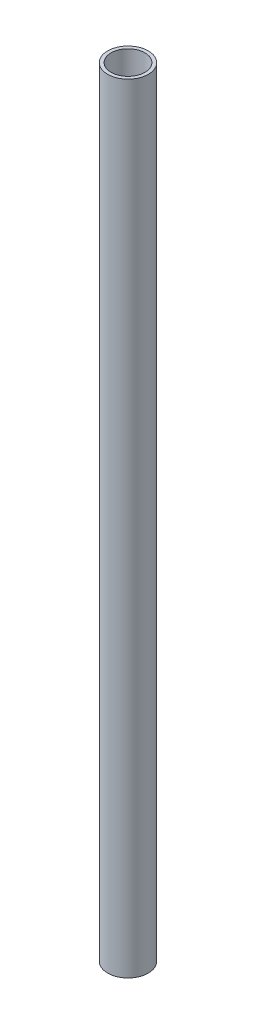
ISO-10303-21;
HEADER;
FILE_DESCRIPTION(('STEP AP214'),'2;1');
FILE_NAME('part.step','',(''),(''),'','','');
FILE_SCHEMA(('AUTOMOTIVE_DESIGN { 1 0 10303 214 1 1 1 1 }'));
ENDSEC;
DATA;
#1=APPLICATION_CONTEXT('core data for automotive mechanical design processes');
#2=APPLICATION_PROTOCOL_DEFINITION('international standard','automotive_design',2000,#1);
#3=PRODUCT_CONTEXT('',#1,'mechanical');
#4=PRODUCT('Part','Part','',(#3));
#5=PRODUCT_RELATED_PRODUCT_CATEGORY('part','',(#4));
#6=PRODUCT_DEFINITION_FORMATION('','',#4);
#7=PRODUCT_DEFINITION_CONTEXT('part definition',#1,'design');
#8=PRODUCT_DEFINITION('design','',#6,#7);
#9=PRODUCT_DEFINITION_SHAPE('','',#8);
#10=(LENGTH_UNIT() NAMED_UNIT(*) SI_UNIT(.MILLI.,.METRE.));
#11=(NAMED_UNIT(*) PLANE_ANGLE_UNIT() SI_UNIT($,.RADIAN.));
#12=(NAMED_UNIT(*) SI_UNIT($,.STERADIAN.) SOLID_ANGLE_UNIT());
#13=UNCERTAINTY_MEASURE_WITH_UNIT(LENGTH_MEASURE(1.E-05),#10,'distance_accuracy_value','');
#14=(GEOMETRIC_REPRESENTATION_CONTEXT(3) GLOBAL_UNCERTAINTY_ASSIGNED_CONTEXT((#13)) GLOBAL_UNIT_ASSIGNED_CONTEXT((#10,
#11,#12)) REPRESENTATION_CONTEXT('',''));
#15=CARTESIAN_POINT('',(0.,0.,0.));
#16=DIRECTION('',(0.,0.,1.));
#17=DIRECTION('',(1.,0.,0.));
#18=AXIS2_PLACEMENT_3D('',#15,#16,#17);
#19=CARTESIAN_POINT('',(0.,230.,0.));
#20=DIRECTION('',(0.,1.,0.));
#21=DIRECTION('',(0.,0.,1.));
#22=AXIS2_PLACEMENT_3D('',#19,#20,#21);
#23=PLANE('',#22);
#24=CARTESIAN_POINT('',(0.,230.,0.));
#25=DIRECTION('',(0.,1.,0.));
#26=DIRECTION('',(0.,0.,1.));
#27=AXIS2_PLACEMENT_3D('',#24,#25,#26);
#28=CIRCLE('',#27,6.);
#29=CARTESIAN_POINT('',(0.,230.,6.));
#30=VERTEX_POINT('',#29);
#31=EDGE_CURVE('E10',#30,#30,#28,.T.);
#32=ORIENTED_EDGE('',*,*,#31,.T.);
#33=EDGE_LOOP('',(#32));
#34=FACE_BOUND('',#33,.T.);
#35=CARTESIAN_POINT('',(0.,230.,0.));
#36=DIRECTION('',(0.,1.,0.));
#37=DIRECTION('',(0.,0.,1.));
#38=AXIS2_PLACEMENT_3D('',#35,#36,#37);
#39=CIRCLE('',#38,5.);
#40=CARTESIAN_POINT('',(0.,230.,5.));
#41=VERTEX_POINT('',#40);
#42=EDGE_CURVE('E44',#41,#41,#39,.T.);
#43=ORIENTED_EDGE('',*,*,#42,.F.);
#44=EDGE_LOOP('',(#43));
#45=FACE_BOUND('',#44,.T.);
#46=ADVANCED_FACE('F33',(#34,#45),#23,.T.);
#47=CARTESIAN_POINT('',(0.,0.,0.));
#48=DIRECTION('',(0.,1.,0.));
#49=DIRECTION('',(0.,0.,1.));
#50=AXIS2_PLACEMENT_3D('',#47,#48,#49);
#51=PLANE('',#50);
#52=CARTESIAN_POINT('',(0.,0.,0.));
#53=DIRECTION('',(0.,1.,0.));
#54=DIRECTION('',(0.,0.,1.));
#55=AXIS2_PLACEMENT_3D('',#52,#53,#54);
#56=CIRCLE('',#55,6.);
#57=CARTESIAN_POINT('',(0.,0.,6.));
#58=VERTEX_POINT('',#57);
#59=EDGE_CURVE('E37',#58,#58,#56,.T.);
#60=ORIENTED_EDGE('',*,*,#59,.F.);
#61=EDGE_LOOP('',(#60));
#62=FACE_BOUND('',#61,.T.);
#63=CARTESIAN_POINT('',(0.,0.,0.));
#64=DIRECTION('',(0.,1.,0.));
#65=DIRECTION('',(0.,0.,1.));
#66=AXIS2_PLACEMENT_3D('',#63,#64,#65);
#67=CIRCLE('',#66,5.);
#68=CARTESIAN_POINT('',(0.,0.,5.));
#69=VERTEX_POINT('',#68);
#70=EDGE_CURVE('E46',#69,#69,#67,.T.);
#71=ORIENTED_EDGE('',*,*,#70,.T.);
#72=EDGE_LOOP('',(#71));
#73=FACE_BOUND('',#72,.T.);
#74=ADVANCED_FACE('F56',(#62,#73),#51,.F.);
#75=CARTESIAN_POINT('',(0.,230.,0.));
#76=DIRECTION('',(0.,-1.,0.));
#77=DIRECTION('',(0.,0.,-1.));
#78=AXIS2_PLACEMENT_3D('',#75,#76,#77);
#79=CYLINDRICAL_SURFACE('',#78,6.);
#80=ORIENTED_EDGE('',*,*,#31,.F.);
#81=EDGE_LOOP('',(#80));
#82=FACE_BOUND('',#81,.T.);
#83=ORIENTED_EDGE('',*,*,#59,.T.);
#84=EDGE_LOOP('',(#83));
#85=FACE_BOUND('',#84,.T.);
#86=ADVANCED_FACE('F35',(#82,#85),#79,.T.);
#87=CARTESIAN_POINT('',(0.,230.,0.));
#88=DIRECTION('',(0.,-1.,0.));
#89=DIRECTION('',(0.,0.,-1.));
#90=AXIS2_PLACEMENT_3D('',#87,#88,#89);
#91=CYLINDRICAL_SURFACE('',#90,5.);
#92=ORIENTED_EDGE('',*,*,#42,.T.);
#93=EDGE_LOOP('',(#92));
#94=FACE_BOUND('',#93,.T.);
#95=ORIENTED_EDGE('',*,*,#70,.F.);
#96=EDGE_LOOP('',(#95));
#97=FACE_BOUND('',#96,.T.);
#98=ADVANCED_FACE('F52',(#94,#97),#91,.F.);
#99=CLOSED_SHELL('',(#46,#74,#86,#98));
#100=MANIFOLD_SOLID_BREP('B2',#99);
#101=ADVANCED_BREP_SHAPE_REPRESENTATION('',(#18,#100),#14);
#102=SHAPE_DEFINITION_REPRESENTATION(#9,#101);
ENDSEC;
END-ISO-10303-21;
